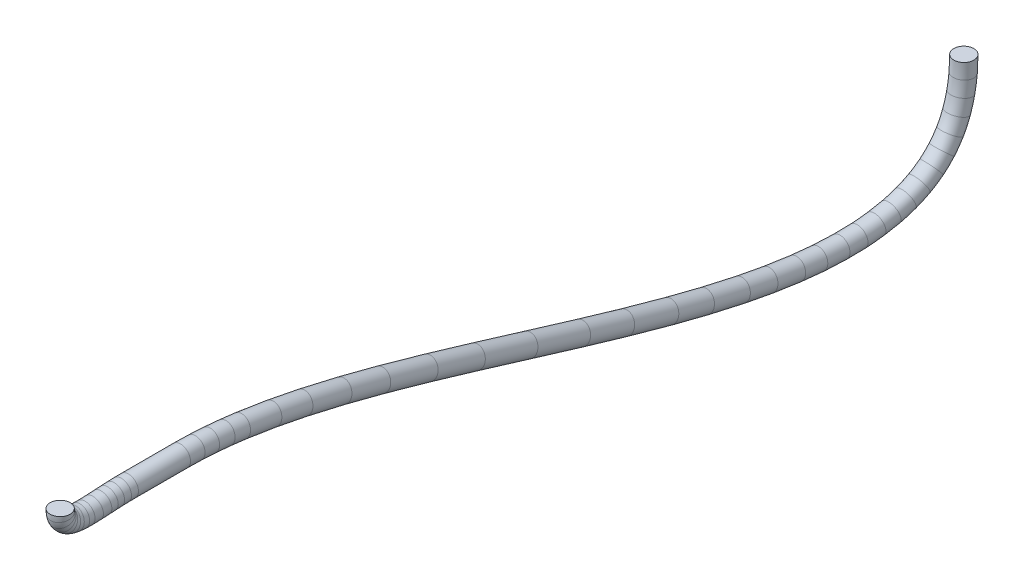
ISO-10303-21;
HEADER;
FILE_DESCRIPTION(('STEP AP214'),'2;1');
FILE_NAME('part.step','',(''),(''),'','','');
FILE_SCHEMA(('AUTOMOTIVE_DESIGN { 1 0 10303 214 1 1 1 1 }'));
ENDSEC;
DATA;
#1=APPLICATION_CONTEXT('core data for automotive mechanical design processes');
#2=APPLICATION_PROTOCOL_DEFINITION('international standard','automotive_design',2000,#1);
#3=PRODUCT_CONTEXT('',#1,'mechanical');
#4=PRODUCT('Part','Part','',(#3));
#5=PRODUCT_RELATED_PRODUCT_CATEGORY('part','',(#4));
#6=PRODUCT_DEFINITION_FORMATION('','',#4);
#7=PRODUCT_DEFINITION_CONTEXT('part definition',#1,'design');
#8=PRODUCT_DEFINITION('design','',#6,#7);
#9=PRODUCT_DEFINITION_SHAPE('','',#8);
#10=(LENGTH_UNIT() NAMED_UNIT(*) SI_UNIT(.MILLI.,.METRE.));
#11=(NAMED_UNIT(*) PLANE_ANGLE_UNIT() SI_UNIT($,.RADIAN.));
#12=(NAMED_UNIT(*) SI_UNIT($,.STERADIAN.) SOLID_ANGLE_UNIT());
#13=UNCERTAINTY_MEASURE_WITH_UNIT(LENGTH_MEASURE(1.E-05),#10,'distance_accuracy_value','');
#14=(GEOMETRIC_REPRESENTATION_CONTEXT(3) GLOBAL_UNCERTAINTY_ASSIGNED_CONTEXT((#13)) GLOBAL_UNIT_ASSIGNED_CONTEXT((#10,
#11,#12)) REPRESENTATION_CONTEXT('',''));
#15=CARTESIAN_POINT('',(0.,0.,0.));
#16=DIRECTION('',(0.,0.,1.));
#17=DIRECTION('',(1.,0.,0.));
#18=AXIS2_PLACEMENT_3D('',#15,#16,#17);
#19=CARTESIAN_POINT('',(5.24968353162512,-230.95,243.324757540876));
#20=DIRECTION('',(0.,-1.,0.));
#21=DIRECTION('',(-1.,0.,0.));
#22=AXIS2_PLACEMENT_3D('',#19,#20,#21);
#23=PLANE('',#22);
#24=CARTESIAN_POINT('',(5.24968353162512,-230.95,243.324757540876));
#25=DIRECTION('',(0.,-1.,0.));
#26=DIRECTION('',(0.,0.,1.));
#27=AXIS2_PLACEMENT_3D('',#24,#25,#26);
#28=CIRCLE('',#27,0.77);
#29=CARTESIAN_POINT('',(5.24968353162512,-230.95,244.094757540876));
#30=VERTEX_POINT('',#29);
#31=EDGE_CURVE('E11',#30,#30,#28,.T.);
#32=ORIENTED_EDGE('',*,*,#31,.F.);
#33=EDGE_LOOP('',(#32));
#34=FACE_BOUND('',#33,.T.);
#35=ADVANCED_FACE('F43',(#34),#23,.F.);
#36=CARTESIAN_POINT('',(5.0748948806526,-230.95,257.270595256948));
#37=DIRECTION('',(0.999921466294673,0.,0.012532407714073));
#38=DIRECTION('',(0.012532407714073,0.,-0.999921466294673));
#39=AXIS2_PLACEMENT_3D('',#36,#37,#38);
#40=TOROIDAL_SURFACE('',#39,13.9469330203995,0.77);
#41=ORIENTED_EDGE('',*,*,#31,.T.);
#42=EDGE_LOOP('',(#41));
#43=FACE_BOUND('',#42,.T.);
#44=CARTESIAN_POINT('',(5.24904137688839,-232.144421709399,243.37599305129));
#45=DIRECTION('',(-0.00107328111655938,-0.996326107369345,0.0856337307484272));
#46=DIRECTION('',(4.60391044394124E-05,0.0856337307484272,0.996326684395488));
#47=AXIS2_PLACEMENT_3D('',#44,#45,#46);
#48=CIRCLE('',#47,0.77);
#49=CARTESIAN_POINT('',(5.24907682699881,-232.078483736723,244.143164598274));
#50=VERTEX_POINT('',#49);
#51=EDGE_CURVE('E53',#50,#50,#48,.T.);
#52=ORIENTED_EDGE('',*,*,#51,.F.);
#53=EDGE_LOOP('',(#52));
#54=FACE_BOUND('',#53,.T.);
#55=ADVANCED_FACE('F328',(#43,#54),#40,.T.);
#56=CARTESIAN_POINT('',(5.12396192345232,-231.273826335851,253.5035753326));
#57=DIRECTION('',(-0.999923726127993,1.56135381442176E-05,-0.0123507765961815));
#58=DIRECTION('',(-0.0123507765976869,0.,0.999923726249874));
#59=AXIS2_PLACEMENT_3D('',#56,#57,#58);
#60=TOROIDAL_SURFACE('',#59,10.1657023386899,0.77);
#61=CARTESIAN_POINT('',(5.24689794232796,-233.326519028539,243.548031978092));
#62=DIRECTION('',(-0.00250920096557245,-0.979401327154709,0.201907761807487));
#63=DIRECTION('',(0.000256872652281758,0.201907759491489,0.979404508195448));
#64=AXIS2_PLACEMENT_3D('',#61,#62,#63);
#65=CIRCLE('',#64,0.77);
#66=CARTESIAN_POINT('',(5.24709573427022,-233.17105005373,244.302173449402));
#67=VERTEX_POINT('',#66);
#68=EDGE_CURVE('E236',#67,#67,#65,.T.);
#69=ORIENTED_EDGE('',*,*,#68,.F.);
#70=EDGE_LOOP('',(#69));
#71=FACE_BOUND('',#70,.T.);
#72=ORIENTED_EDGE('',*,*,#51,.T.);
#73=EDGE_LOOP('',(#72));
#74=FACE_BOUND('',#73,.T.);
#75=ADVANCED_FACE('F335',(#71,#74),#60,.T.);
#76=CARTESIAN_POINT('',(5.14297806845295,-231.577711003224,252.029747241306));
#77=DIRECTION('',(-0.999924861807434,3.46504543539627E-05,-0.0122584476476255));
#78=DIRECTION('',(-0.0122584476549845,0.,0.999924862407716));
#79=AXIS2_PLACEMENT_3D('',#76,#77,#78);
#80=TOROIDAL_SURFACE('',#79,8.66075185280264,0.77);
#81=CARTESIAN_POINT('',(5.24293003548449,-234.474581719558,243.868450021319));
#82=DIRECTION('',(-0.0041328895323715,-0.942401928786135,0.334457058296406));
#83=DIRECTION('',(0.000714986324046932,0.334457044428597,0.942410724804553));
#84=AXIS2_PLACEMENT_3D('',#81,#82,#83);
#85=CIRCLE('',#84,0.77);
#86=CARTESIAN_POINT('',(5.24348057495401,-234.217049795348,244.594106279419));
#87=VERTEX_POINT('',#86);
#88=EDGE_CURVE('E212',#87,#87,#85,.T.);
#89=ORIENTED_EDGE('',*,*,#88,.F.);
#90=EDGE_LOOP('',(#89));
#91=FACE_BOUND('',#90,.T.);
#92=ORIENTED_EDGE('',*,*,#68,.T.);
#93=EDGE_LOOP('',(#92));
#94=FACE_BOUND('',#93,.T.);
#95=ADVANCED_FACE('F369',(#91,#94),#80,.T.);
#96=CARTESIAN_POINT('',(5.16728173385934,-232.241525843028,250.1596119713));
#97=DIRECTION('',(-0.999927259751701,0.000104786281682033,-0.0120608550811853));
#98=DIRECTION('',(-0.0120608551474004,0.,0.999927265241384));
#99=AXIS2_PLACEMENT_3D('',#96,#97,#98);
#100=TOROIDAL_SURFACE('',#99,6.67615008025853,0.77);
#101=CARTESIAN_POINT('',(5.23682959366195,-235.556122237873,244.364821748298));
#102=DIRECTION('',(-0.00607896479311672,-0.868046320935459,0.496445999981325));
#103=DIRECTION('',(0.00162868645288771,0.496445919935974,0.868066124186034));
#104=AXIS2_PLACEMENT_3D('',#101,#102,#103);
#105=CIRCLE('',#104,0.77);
#106=CARTESIAN_POINT('',(5.23808368223067,-235.173858879522,245.033232663921));
#107=VERTEX_POINT('',#106);
#108=EDGE_CURVE('E210',#107,#107,#105,.T.);
#109=ORIENTED_EDGE('',*,*,#108,.F.);
#110=EDGE_LOOP('',(#109));
#111=FACE_BOUND('',#110,.T.);
#112=ORIENTED_EDGE('',*,*,#88,.T.);
#113=EDGE_LOOP('',(#112));
#114=FACE_BOUND('',#113,.T.);
#115=ADVANCED_FACE('F424',(#111,#114),#100,.T.);
#116=CARTESIAN_POINT('',(5.17379080379132,-232.518432694903,249.675514193058));
#117=DIRECTION('',(-0.999928443325836,0.000161505477794451,-0.0119616948611251));
#118=DIRECTION('',(-0.0119616950171297,0.,0.999928456366913));
#119=AXIS2_PLACEMENT_3D('',#116,#117,#118);
#120=TOROIDAL_SURFACE('',#119,6.11841367442019,0.77);
#121=CARTESIAN_POINT('',(5.22911386483791,-236.461643425625,244.997585764429));
#122=DIRECTION('',(-0.00783258490682083,-0.764619016978677,0.644434953651833));
#123=DIRECTION('',(0.00288966355690776,0.644434724493458,0.764653866603426));
#124=AXIS2_PLACEMENT_3D('',#121,#122,#123);
#125=CIRCLE('',#124,0.77);
#126=CARTESIAN_POINT('',(5.23133890577673,-235.965428687765,245.586369241714));
#127=VERTEX_POINT('',#126);
#128=EDGE_CURVE('E213',#127,#127,#125,.T.);
#129=ORIENTED_EDGE('',*,*,#128,.F.);
#130=EDGE_LOOP('',(#129));
#131=FACE_BOUND('',#130,.T.);
#132=ORIENTED_EDGE('',*,*,#108,.T.);
#133=EDGE_LOOP('',(#132));
#134=FACE_BOUND('',#133,.T.);
#135=ADVANCED_FACE('F420',(#131,#134),#120,.T.);
#136=CARTESIAN_POINT('',(5.17630312424123,-232.598910661164,249.58005800289));
#137=DIRECTION('',(-0.999930503616955,0.00031025322509349,-0.0117852314053985));
#138=DIRECTION('',(-0.0117852319726044,0.,0.999930551742146));
#139=AXIS2_PLACEMENT_3D('',#136,#137,#138);
#140=TOROIDAL_SURFACE('',#139,5.99354195782581,0.77);
#141=CARTESIAN_POINT('',(5.2196025202202,-237.237006733154,245.784174022903));
#142=DIRECTION('',(-0.00931648116066426,-0.633370134036581,0.773792915765754));
#143=DIRECTION('',(0.00447648709641838,0.773792328230094,0.63342355011124));
#144=AXIS2_PLACEMENT_3D('',#141,#142,#143);
#145=CIRCLE('',#144,0.77);
#146=CARTESIAN_POINT('',(5.22304941528444,-236.641186640417,246.271910156488));
#147=VERTEX_POINT('',#146);
#148=EDGE_CURVE('E224',#147,#147,#145,.T.);
#149=ORIENTED_EDGE('',*,*,#148,.F.);
#150=EDGE_LOOP('',(#149));
#151=FACE_BOUND('',#150,.T.);
#152=ORIENTED_EDGE('',*,*,#128,.T.);
#153=EDGE_LOOP('',(#152));
#154=FACE_BOUND('',#153,.T.);
#155=ADVANCED_FACE('F416',(#151,#154),#140,.T.);
#156=CARTESIAN_POINT('',(5.17427278205257,-232.287492829978,249.83493735603));
#157=DIRECTION('',(-0.999931484793308,0.000416360646929899,-0.0116983914647493));
#158=DIRECTION('',(-0.0116983924787437,0.,0.999931571465474));
#159=AXIS2_PLACEMENT_3D('',#156,#157,#158);
#160=TOROIDAL_SURFACE('',#159,6.3959695311887,0.77);
#161=CARTESIAN_POINT('',(5.20845243151708,-237.870619210664,246.714687716538));
#162=DIRECTION('',(-0.0104148005759073,-0.487875323146402,0.87285119063547));
#163=DIRECTION('',(0.00621966975069926,0.872850040660919,0.487948893047647));
#164=AXIS2_PLACEMENT_3D('',#161,#162,#163);
#165=CIRCLE('',#164,0.77);
#166=CARTESIAN_POINT('',(5.21324157722512,-237.198524679355,247.090408364185));
#167=VERTEX_POINT('',#166);
#168=EDGE_CURVE('E227',#167,#167,#165,.T.);
#169=ORIENTED_EDGE('',*,*,#168,.F.);
#170=EDGE_LOOP('',(#169));
#171=FACE_BOUND('',#170,.T.);
#172=ORIENTED_EDGE('',*,*,#148,.T.);
#173=EDGE_LOOP('',(#172));
#174=FACE_BOUND('',#173,.T.);
#175=ADVANCED_FACE('F419',(#171,#174),#160,.T.);
#176=CARTESIAN_POINT('',(5.1680661383168,-230.889365269744,250.616338930103));
#177=DIRECTION('',(-0.999933013635121,0.000673159565444983,-0.0115548733781435));
#178=DIRECTION('',(-0.011554875996154,0.,0.999933240191921));
#179=AXIS2_PLACEMENT_3D('',#176,#177,#178);
#180=TOROIDAL_SURFACE('',#179,7.99765089464502,0.77);
#181=CARTESIAN_POINT('',(5.19633890298933,-238.349911800838,247.735043051377));
#182=DIRECTION('',(-0.0110213915987776,-0.360284488203109,0.932777367053602));
#183=DIRECTION('',(0.0077342093815182,0.932775406000503,0.360375115630698));
#184=AXIS2_PLACEMENT_3D('',#181,#182,#183);
#185=CIRCLE('',#184,0.77);
#186=CARTESIAN_POINT('',(5.2022942442131,-237.631674738218,248.012531890413));
#187=VERTEX_POINT('',#186);
#188=EDGE_CURVE('E269',#187,#187,#185,.T.);
#189=ORIENTED_EDGE('',*,*,#188,.F.);
#190=EDGE_LOOP('',(#189));
#191=FACE_BOUND('',#190,.T.);
#192=ORIENTED_EDGE('',*,*,#168,.T.);
#193=EDGE_LOOP('',(#192));
#194=FACE_BOUND('',#193,.T.);
#195=ADVANCED_FACE('F462',(#191,#194),#180,.T.);
#196=CARTESIAN_POINT('',(5.1649936619859,-229.659352754398,251.091393945652));
#197=DIRECTION('',(-0.99993360202921,0.000832261267531237,-0.0114934274292904));
#198=DIRECTION('',(-0.0114934314098044,0.,0.999933948335803));
#199=AXIS2_PLACEMENT_3D('',#196,#197,#198);
#200=TOROIDAL_SURFACE('',#199,9.31621652760916,0.77);
#201=CARTESIAN_POINT('',(5.18322899083766,-238.701932792349,248.850121066387));
#202=DIRECTION('',(-0.0113560651723369,-0.240584108696933,0.970561861205304));
#203=DIRECTION('',(0.00914133689401875,0.970558910298777,0.240690335492395));
#204=AXIS2_PLACEMENT_3D('',#201,#202,#203);
#205=CIRCLE('',#204,0.77);
#206=CARTESIAN_POINT('',(5.19026782024605,-237.954602431419,249.035452624716));
#207=VERTEX_POINT('',#206);
#208=EDGE_CURVE('E267',#207,#207,#205,.T.);
#209=ORIENTED_EDGE('',*,*,#208,.F.);
#210=EDGE_LOOP('',(#209));
#211=FACE_BOUND('',#210,.T.);
#212=ORIENTED_EDGE('',*,*,#188,.T.);
#213=EDGE_LOOP('',(#212));
#214=FACE_BOUND('',#213,.T.);
#215=ADVANCED_FACE('F449',(#211,#214),#200,.T.);
#216=CARTESIAN_POINT('',(5.16317642336946,-226.286435817303,251.927455623717));
#217=DIRECTION('',(-0.999934288916584,0.00121053123399229,-0.011399669425782));
#218=DIRECTION('',(-0.0113996777782484,0.,0.999935021562177));
#219=AXIS2_PLACEMENT_3D('',#216,#217,#218);
#220=TOROIDAL_SURFACE('',#219,12.7912061675432,0.77);
#221=CARTESIAN_POINT('',(5.16986690857264,-238.931256444879,249.997838626903));
#222=DIRECTION('',(-0.0114518236066476,-0.150851017771999,0.988490175051444));
#223=DIRECTION('',(0.0101859073416779,0.988486109490571,0.150968402772966));
#224=AXIS2_PLACEMENT_3D('',#221,#222,#223);
#225=CIRCLE('',#224,0.77);
#226=CARTESIAN_POINT('',(5.17771005722573,-238.170122140572,250.114084297038));
#227=VERTEX_POINT('',#226);
#228=EDGE_CURVE('E262',#227,#227,#225,.T.);
#229=ORIENTED_EDGE('',*,*,#228,.F.);
#230=EDGE_LOOP('',(#229));
#231=FACE_BOUND('',#230,.T.);
#232=ORIENTED_EDGE('',*,*,#208,.T.);
#233=EDGE_LOOP('',(#232));
#234=FACE_BOUND('',#233,.T.);
#235=ADVANCED_FACE('F443',(#231,#234),#220,.T.);
#236=CARTESIAN_POINT('',(5.16548148912275,-223.946716401397,252.28454106705));
#237=DIRECTION('',(-0.99993438386414,0.00144161136022933,-0.0113644059646102));
#238=DIRECTION('',(-0.0113644177736289,0.,0.999935422919233));
#239=AXIS2_PLACEMENT_3D('',#236,#237,#238);
#240=TOROIDAL_SURFACE('',#239,15.158016611563,0.77);
#241=CARTESIAN_POINT('',(5.15422136859448,-239.076266224772,251.356067616637));
#242=DIRECTION('',(-0.0114313665546594,-0.0612405030804673,0.998057575814714));
#243=DIRECTION('',(0.0112180134444051,0.998052125044579,0.0613686554224686));
#244=AXIS2_PLACEMENT_3D('',#241,#242,#243);
#245=CIRCLE('',#244,0.77);
#246=CARTESIAN_POINT('',(5.16285923894667,-238.307766088488,251.403321481312));
#247=VERTEX_POINT('',#246);
#248=EDGE_CURVE('E216',#247,#247,#245,.T.);
#249=ORIENTED_EDGE('',*,*,#248,.F.);
#250=EDGE_LOOP('',(#249));
#251=FACE_BOUND('',#250,.T.);
#252=ORIENTED_EDGE('',*,*,#228,.T.);
#253=EDGE_LOOP('',(#252));
#254=FACE_BOUND('',#253,.T.);
#255=ADVANCED_FACE('F438',(#251,#254),#240,.T.);
#256=CARTESIAN_POINT('',(5.18281952873429,-217.676568517406,252.669473978342));
#257=DIRECTION('',(-0.999933770131024,0.00203156120988107,-0.0113281997954771));
#258=DIRECTION('',(-0.0113282231726545,0.,0.999935833621213));
#259=AXIS2_PLACEMENT_3D('',#256,#257,#258);
#260=TOROIDAL_SURFACE('',#259,21.439984050655,0.77);
#261=CARTESIAN_POINT('',(5.13866380234599,-239.116442461783,252.722120093432));
#262=DIRECTION('',(-0.0113231530981032,0.00247867876730517,0.999932818921094));
#263=DIRECTION('',(0.0119436112864676,0.999925926538434,-0.00234341325687878));
#264=AXIS2_PLACEMENT_3D('',#261,#262,#263);
#265=CIRCLE('',#264,0.77);
#266=CARTESIAN_POINT('',(5.14786038303657,-238.346499498348,252.720315665224));
#267=VERTEX_POINT('',#266);
#268=EDGE_CURVE('E214',#267,#267,#265,.T.);
#269=ORIENTED_EDGE('',*,*,#268,.F.);
#270=EDGE_LOOP('',(#269));
#271=FACE_BOUND('',#270,.T.);
#272=ORIENTED_EDGE('',*,*,#248,.T.);
#273=EDGE_LOOP('',(#272));
#274=FACE_BOUND('',#273,.T.);
#275=ADVANCED_FACE('F361',(#271,#274),#260,.T.);
#276=CARTESIAN_POINT('',(5.20077807656468,-213.557380502181,252.65946650955));
#277=DIRECTION('',(-0.999932937891432,0.00240229079996762,-0.0113291093525696));
#278=DIRECTION('',(-0.0113291420428623,0.,0.999935823210956));
#279=AXIS2_PLACEMENT_3D('',#276,#277,#278);
#280=TOROIDAL_SURFACE('',#279,25.5592142271517,0.77);
#281=CARTESIAN_POINT('',(5.11965239461493,-239.056251354399,254.412873420404));
#282=DIRECTION('',(-0.0111375608198021,0.0686331117157715,0.997579796665508));
#283=DIRECTION('',(0.0126873957821722,0.997571066073339,-0.0684908615916703));
#284=AXIS2_PLACEMENT_3D('',#281,#282,#283);
#285=CIRCLE('',#284,0.77);
#286=CARTESIAN_POINT('',(5.1294216893672,-238.288121633523,254.360135456978));
#287=VERTEX_POINT('',#286);
#288=EDGE_CURVE('E217',#287,#287,#285,.T.);
#289=ORIENTED_EDGE('',*,*,#288,.F.);
#290=EDGE_LOOP('',(#289));
#291=FACE_BOUND('',#290,.T.);
#292=ORIENTED_EDGE('',*,*,#268,.T.);
#293=EDGE_LOOP('',(#292));
#294=FACE_BOUND('',#293,.T.);
#295=ADVANCED_FACE('F357',(#291,#294),#280,.T.);
#296=CARTESIAN_POINT('',(5.2732480137285,-202.396588050501,251.892417317701));
#297=DIRECTION('',(-0.999929239218927,0.0034058226866631,-0.0113981106716926));
#298=DIRECTION('',(-0.0113981767791906,0.,0.999935038673068));
#299=AXIS2_PLACEMENT_3D('',#296,#297,#298);
#300=TOROIDAL_SURFACE('',#299,36.7465264227114,0.77);
#301=CARTESIAN_POINT('',(5.10097097834605,-238.901245847709,256.098066359986));
#302=DIRECTION('',(-0.0109332901309572,0.114495586102539,0.993363591002785));
#303=DIRECTION('',(0.013195763290434,0.993352983136303,-0.1143491264741));
#304=AXIS2_PLACEMENT_3D('',#301,#302,#303);
#305=CIRCLE('',#304,0.77);
#306=CARTESIAN_POINT('',(5.11113171607968,-238.136364050694,256.010017532601));
#307=VERTEX_POINT('',#306);
#308=EDGE_CURVE('E229',#307,#307,#305,.T.);
#309=ORIENTED_EDGE('',*,*,#308,.F.);
#310=EDGE_LOOP('',(#309));
#311=FACE_BOUND('',#310,.T.);
#312=ORIENTED_EDGE('',*,*,#288,.T.);
#313=EDGE_LOOP('',(#312));
#314=FACE_BOUND('',#313,.T.);
#315=ADVANCED_FACE('F360',(#311,#314),#300,.T.);
#316=CARTESIAN_POINT('',(5.33695933223803,-195.10511856413,251.052700112808));
#317=DIRECTION('',(-0.999925902291017,0.00406610011188762,-0.0114741778518016));
#318=DIRECTION('',(-0.011474272705245,0.,0.999934168366041));
#319=AXIS2_PLACEMENT_3D('',#316,#317,#318);
#320=TOROIDAL_SURFACE('',#319,44.0864171385114,0.77);
#321=CARTESIAN_POINT('',(5.07791749703297,-238.605597552684,258.211848190952));
#322=DIRECTION('',(-0.0106613884787904,0.162444361746452,0.986660105675958));
#323=DIRECTION('',(0.0137186629416303,0.986647080967109,-0.162293979882735));
#324=AXIS2_PLACEMENT_3D('',#321,#322,#323);
#325=CIRCLE('',#324,0.77);
#326=CARTESIAN_POINT('',(5.08848086749803,-237.845879300339,258.086881826442));
#327=VERTEX_POINT('',#326);
#328=EDGE_CURVE('E209',#327,#327,#325,.T.);
#329=ORIENTED_EDGE('',*,*,#328,.F.);
#330=EDGE_LOOP('',(#329));
#331=FACE_BOUND('',#330,.T.);
#332=ORIENTED_EDGE('',*,*,#308,.T.);
#333=EDGE_LOOP('',(#332));
#334=FACE_BOUND('',#333,.T.);
#335=ADVANCED_FACE('F355',(#331,#334),#320,.T.);
#336=CARTESIAN_POINT('',(5.58426599900101,-174.701153139808,247.696050250386));
#337=DIRECTION('',(-0.999912601927665,0.0059827950896209,-0.0117896000424723));
#338=DIRECTION('',(-0.0117898110456484,0.,0.999930497762474));
#339=AXIS2_PLACEMENT_3D('',#336,#337,#338);
#340=TOROIDAL_SURFACE('',#339,64.7658583734564,0.77);
#341=CARTESIAN_POINT('',(5.05543554196793,-238.224139513753,260.312188777444));
#342=DIRECTION('',(-0.010397929528536,0.194875369792719,0.980772895888579));
#343=DIRECTION('',(0.0140657835414628,0.980757382188605,-0.194723165072674));
#344=AXIS2_PLACEMENT_3D('',#341,#342,#343);
#345=CIRCLE('',#344,0.77);
#346=CARTESIAN_POINT('',(5.06626619529486,-237.468956329467,260.162251940338));
#347=VERTEX_POINT('',#346);
#348=EDGE_CURVE('E147',#347,#347,#345,.T.);
#349=ORIENTED_EDGE('',*,*,#348,.F.);
#350=EDGE_LOOP('',(#349));
#351=FACE_BOUND('',#350,.T.);
#352=ORIENTED_EDGE('',*,*,#328,.T.);
#353=EDGE_LOOP('',(#352));
#354=FACE_BOUND('',#353,.T.);
#355=ADVANCED_FACE('F351',(#351,#354),#340,.T.);
#356=CARTESIAN_POINT('',(5.81591775887713,-160.475014869845,244.871833483146));
#357=DIRECTION('',(-0.999899919531076,0.00738368115377129,-0.0120678156418905));
#358=DIRECTION('',(-0.0120681446164382,0.,0.999927177291185));
#359=AXIS2_PLACEMENT_3D('',#356,#357,#358);
#360=TOROIDAL_SURFACE('',#359,79.2711125676327,0.77);
#361=CARTESIAN_POINT('',(5.02680457670815,-237.630170501913,263.047876712832));
#362=DIRECTION('',(-0.0100526920883572,0.229386802407344,0.973283431618514));
#363=DIRECTION('',(0.0144269577185918,0.973264576160402,-0.229233347666301));
#364=AXIS2_PLACEMENT_3D('',#361,#362,#363);
#365=CIRCLE('',#364,0.77);
#366=CARTESIAN_POINT('',(5.03791333415147,-236.880756778269,262.871367035129));
#367=VERTEX_POINT('',#366);
#368=EDGE_CURVE('E152',#367,#367,#365,.T.);
#369=ORIENTED_EDGE('',*,*,#368,.F.);
#370=EDGE_LOOP('',(#369));
#371=FACE_BOUND('',#370,.T.);
#372=ORIENTED_EDGE('',*,*,#348,.T.);
#373=EDGE_LOOP('',(#372));
#374=FACE_BOUND('',#373,.T.);
#375=ADVANCED_FACE('F354',(#371,#374),#360,.T.);
#376=CARTESIAN_POINT('',(6.89164570977547,-115.42764607524,234.266024745883));
#377=DIRECTION('',(-0.999839165076537,0.0121510282503366,-0.0131907729687246));
#378=DIRECTION('',(-0.0131917468688151,0.,0.99991298512148));
#379=AXIS2_PLACEMENT_3D('',#376,#377,#378);
#380=TOROIDAL_SURFACE('',#379,125.560063759742,0.77);
#381=CARTESIAN_POINT('',(4.99912407683018,-236.957583465082,265.765584921231));
#382=DIRECTION('',(-0.00971902793698233,0.251030915605625,0.967930276366104));
#383=DIRECTION('',(0.0146474139412616,0.967907881078682,-0.250878032140339));
#384=AXIS2_PLACEMENT_3D('',#381,#382,#383);
#385=CIRCLE('',#384,0.77);
#386=CARTESIAN_POINT('',(5.01040258556495,-236.212294396651,265.572408836483));
#387=VERTEX_POINT('',#386);
#388=EDGE_CURVE('E223',#387,#387,#385,.T.);
#389=ORIENTED_EDGE('',*,*,#388,.F.);
#390=EDGE_LOOP('',(#389));
#391=FACE_BOUND('',#390,.T.);
#392=ORIENTED_EDGE('',*,*,#368,.T.);
#393=EDGE_LOOP('',(#392));
#394=FACE_BOUND('',#393,.T.);
#395=ADVANCED_FACE('F380',(#391,#394),#380,.T.);
#396=CARTESIAN_POINT('',(8.13767229498654,-79.5711898985418,224.979230979255));
#397=DIRECTION('',(-0.999766490161775,0.0162437742654656,-0.0142514892982588));
#398=DIRECTION('',(0.0162454241122463,0.999868034390246,0.));
#399=AXIS2_PLACEMENT_3D('',#396,#397,#398);
#400=TOROIDAL_SURFACE('',#399,162.615663552684,0.77);
#401=CARTESIAN_POINT('',(4.96593820793933,-236.045546054089,269.133166265565));
#402=DIRECTION('',(-0.0093027081243556,0.271737825723965,0.962326355085615));
#403=DIRECTION('',(0.0148514872069348,0.962299395928259,-0.271586645334139));
#404=AXIS2_PLACEMENT_3D('',#401,#402,#403);
#405=CIRCLE('',#404,0.77);
#406=CARTESIAN_POINT('',(4.97737385308867,-235.304575519224,268.924044548658));
#407=VERTEX_POINT('',#406);
#408=EDGE_CURVE('E221',#407,#407,#405,.T.);
#409=ORIENTED_EDGE('',*,*,#408,.F.);
#410=EDGE_LOOP('',(#409));
#411=FACE_BOUND('',#410,.T.);
#412=ORIENTED_EDGE('',*,*,#388,.T.);
#413=EDGE_LOOP('',(#412));
#414=FACE_BOUND('',#413,.T.);
#415=ADVANCED_FACE('F414',(#411,#414),#400,.T.);
#416=CARTESIAN_POINT('',(18.499072242577,83.9183868882644,178.913867798837));
#417=DIRECTION('',(-0.999129131083777,0.0366199012053684,-0.0199990563648998));
#418=DIRECTION('',(0.0366272266920211,0.999328998010591,0.));
#419=AXIS2_PLACEMENT_3D('',#416,#417,#418);
#420=TOROIDAL_SURFACE('',#419,332.71547291427,0.77);
#421=CARTESIAN_POINT('',(4.93422373253751,-235.079814249697,272.485917430187));
#422=DIRECTION('',(-0.0088756431010214,0.281807888255374,0.959429797888616));
#423=DIRECTION('',(0.0149467755076472,0.959397788967474,-0.281660214489455));
#424=AXIS2_PLACEMENT_3D('',#421,#422,#423);
#425=CIRCLE('',#424,0.77);
#426=CARTESIAN_POINT('',(4.9457327496784,-234.341077952192,272.26903906503));
#427=VERTEX_POINT('',#426);
#428=EDGE_CURVE('E202',#427,#427,#425,.T.);
#429=ORIENTED_EDGE('',*,*,#428,.F.);
#430=EDGE_LOOP('',(#429));
#431=FACE_BOUND('',#430,.T.);
#432=ORIENTED_EDGE('',*,*,#408,.T.);
#433=EDGE_LOOP('',(#432));
#434=FACE_BOUND('',#433,.T.);
#435=ADVANCED_FACE('F366',(#431,#434),#420,.T.);
#436=CARTESIAN_POINT('',(50.8662060077846,340.779255745024,103.7670044643));
#437=DIRECTION('',(-0.997043751117185,0.0707369243477187,-0.0300007648568693));
#438=DIRECTION('',(0.0707687790914665,0.997492746793631,0.));
#439=AXIS2_PLACEMENT_3D('',#436,#437,#438);
#440=TOROIDAL_SURFACE('',#439,601.821806752887,0.77);
#441=CARTESIAN_POINT('',(4.89817440198765,-233.885994760051,276.498811076563));
#442=DIRECTION('',(-0.00834446385745979,0.288457883314737,0.957456223268987));
#443=DIRECTION('',(0.0150065627843381,0.957417857161314,-0.288315538710694));
#444=AXIS2_PLACEMENT_3D('',#441,#442,#443);
#445=CIRCLE('',#444,0.77);
#446=CARTESIAN_POINT('',(4.90972945533159,-233.148783010036,276.276808111756));
#447=VERTEX_POINT('',#446);
#448=EDGE_CURVE('E200',#447,#447,#445,.T.);
#449=ORIENTED_EDGE('',*,*,#448,.F.);
#450=EDGE_LOOP('',(#449));
#451=FACE_BOUND('',#450,.T.);
#452=ORIENTED_EDGE('',*,*,#428,.T.);
#453=EDGE_LOOP('',(#452));
#454=FACE_BOUND('',#453,.T.);
#455=ADVANCED_FACE('F363',(#451,#454),#440,.T.);
#456=CARTESIAN_POINT('',(128.322876109013,-1109.10272826028,541.255646105514));
#457=DIRECTION('',(0.990977551170572,0.130471344857442,-0.0306711794208627));
#458=DIRECTION('',(0.130532756772581,-0.991443997111965,0.));
#459=AXIS2_PLACEMENT_3D('',#456,#457,#458);
#460=TOROIDAL_SURFACE('',#459,922.677716911398,0.77);
#461=CARTESIAN_POINT('',(4.86450797302669,-232.687270950494,280.510278341283));
#462=DIRECTION('',(-0.00773737452209147,0.28415059232391,0.958748441415931));
#463=DIRECTION('',(0.014970480312079,0.958702606388962,-0.284016191831094));
#464=AXIS2_PLACEMENT_3D('',#461,#462,#463);
#465=CIRCLE('',#464,0.77);
#466=CARTESIAN_POINT('',(4.87603524286699,-231.949069943574,280.291585873574));
#467=VERTEX_POINT('',#466);
#468=EDGE_CURVE('E203',#467,#467,#465,.T.);
#469=ORIENTED_EDGE('',*,*,#468,.F.);
#470=EDGE_LOOP('',(#469));
#471=FACE_BOUND('',#470,.T.);
#472=ORIENTED_EDGE('',*,*,#448,.T.);
#473=EDGE_LOOP('',(#472));
#474=FACE_BOUND('',#473,.T.);
#475=ADVANCED_FACE('F345',(#471,#474),#460,.T.);
#476=CARTESIAN_POINT('',(33.6032976752988,-640.34212333683,401.561563052911));
#477=DIRECTION('',(0.997694178442122,0.0668434624221849,-0.0117591595835847));
#478=DIRECTION('',(0.0668480843861309,-0.997763165091749,0.));
#479=AXIS2_PLACEMENT_3D('',#476,#477,#478);
#480=TOROIDAL_SURFACE('',#479,426.218031338437,0.77);
#481=CARTESIAN_POINT('',(4.83661388280626,-231.637820788354,284.109099392248));
#482=DIRECTION('',(-0.00714402019866776,0.275727216171857,0.961209376378279));
#483=DIRECTION('',(0.0149052570580215,0.961156479378031,-0.275601261720011));
#484=AXIS2_PLACEMENT_3D('',#481,#482,#483);
#485=CIRCLE('',#484,0.77);
#486=CARTESIAN_POINT('',(4.84809093074094,-230.897730299233,283.896886420723));
#487=VERTEX_POINT('',#486);
#488=EDGE_CURVE('E204',#487,#487,#485,.T.);
#489=ORIENTED_EDGE('',*,*,#488,.F.);
#490=EDGE_LOOP('',(#489));
#491=FACE_BOUND('',#490,.T.);
#492=ORIENTED_EDGE('',*,*,#468,.T.);
#493=EDGE_LOOP('',(#492));
#494=FACE_BOUND('',#493,.T.);
#495=ADVANCED_FACE('F341',(#491,#494),#480,.T.);
#496=CARTESIAN_POINT('',(12.1184575935641,-416.374990909985,337.155905356285));
#497=DIRECTION('',(0.999257547958647,0.0383608735236405,-0.00357718187608632));
#498=DIRECTION('',(0.0383611189632797,-0.9992639413848,0.));
#499=AXIS2_PLACEMENT_3D('',#496,#497,#498);
#500=TOROIDAL_SURFACE('',#499,192.340351708533,0.77);
#501=CARTESIAN_POINT('',(4.81121754884198,-230.639344234988,287.722266075813));
#502=DIRECTION('',(-0.0064048307299186,0.256956359192495,0.966401783738968));
#503=DIRECTION('',(0.0147734023820948,0.96634044815675,-0.256842139919191));
#504=AXIS2_PLACEMENT_3D('',#501,#502,#503);
#505=CIRCLE('',#504,0.77);
#506=CARTESIAN_POINT('',(4.82259306867619,-229.895262089907,287.524497628075));
#507=VERTEX_POINT('',#506);
#508=EDGE_CURVE('E207',#507,#507,#505,.T.);
#509=ORIENTED_EDGE('',*,*,#508,.F.);
#510=EDGE_LOOP('',(#509));
#511=FACE_BOUND('',#510,.T.);
#512=ORIENTED_EDGE('',*,*,#488,.T.);
#513=EDGE_LOOP('',(#512));
#514=FACE_BOUND('',#513,.T.);
#515=ADVANCED_FACE('F344',(#511,#514),#500,.T.);
#516=CARTESIAN_POINT('',(9.66448189777065,-373.327390931654,325.69372466948));
#517=DIRECTION('',(0.999439724113134,0.0333938837880907,-0.00225530268720076));
#518=DIRECTION('',(0.0333939687155765,-0.999442265893045,0.));
#519=AXIS2_PLACEMENT_3D('',#516,#517,#518);
#520=TOROIDAL_SURFACE('',#519,147.733762264018,0.77);
#521=CARTESIAN_POINT('',(4.79270313539403,-229.885456335324,290.680274630478));
#522=DIRECTION('',(-0.00572469074170773,0.236945297043338,0.97150612665333));
#523=DIRECTION('',(0.01464822169155,0.97143767730412,-0.236842286585931));
#524=AXIS2_PLACEMENT_3D('',#521,#522,#523);
#525=CIRCLE('',#524,0.77);
#526=CARTESIAN_POINT('',(4.80398226609652,-229.1374493238,290.497906069807));
#527=VERTEX_POINT('',#526);
#528=EDGE_CURVE('E249',#527,#527,#525,.T.);
#529=ORIENTED_EDGE('',*,*,#528,.F.);
#530=EDGE_LOOP('',(#529));
#531=FACE_BOUND('',#530,.T.);
#532=ORIENTED_EDGE('',*,*,#508,.T.);
#533=EDGE_LOOP('',(#532));
#534=FACE_BOUND('',#533,.T.);
#535=ADVANCED_FACE('F388',(#531,#534),#520,.T.);
#536=CARTESIAN_POINT('',(7.36681135954643,-321.396017738412,313.014393307167));
#537=DIRECTION('',(0.999610434732199,0.0278952473699257,-0.000913207903478893));
#538=DIRECTION('',(0.0278952590015353,-0.999610851544358,0.));
#539=AXIS2_PLACEMENT_3D('',#536,#537,#538);
#540=TOROIDAL_SURFACE('',#539,94.231744855555,0.77);
#541=CARTESIAN_POINT('',(4.77658192464515,-229.210312221856,293.657013618486));
#542=DIRECTION('',(-0.00483694938135428,0.205368203395822,0.978672828352077));
#543=DIRECTION('',(0.0144772918789377,0.978596088579756,-0.20528054811953));
#544=AXIS2_PLACEMENT_3D('',#541,#542,#543);
#545=CIRCLE('',#544,0.77);
#546=CARTESIAN_POINT('',(4.78772943939193,-228.456793233649,293.498947596434));
#547=VERTEX_POINT('',#546);
#548=EDGE_CURVE('E277',#547,#547,#545,.T.);
#549=ORIENTED_EDGE('',*,*,#548,.F.);
#550=EDGE_LOOP('',(#549));
#551=FACE_BOUND('',#550,.T.);
#552=ORIENTED_EDGE('',*,*,#528,.T.);
#553=EDGE_LOOP('',(#552));
#554=FACE_BOUND('',#553,.T.);
#555=ADVANCED_FACE('F385',(#551,#554),#540,.T.);
#556=CARTESIAN_POINT('',(6.78251166603386,-305.066460826247,309.584852917211));
#557=DIRECTION('',(0.999653591451658,0.0263127276781314,-0.000580913020665926));
#558=DIRECTION('',(0.0263127321178783,-0.99965376012322,0.));
#559=AXIS2_PLACEMENT_3D('',#556,#557,#558);
#560=TOROIDAL_SURFACE('',#559,77.5362824743677,0.77);
#561=CARTESIAN_POINT('',(4.76585743241786,-228.750436194182,296.032266816946));
#562=DIRECTION('',(-0.00402743754319159,0.174744808971003,0.984605520746519));
#563=DIRECTION('',(0.0143390886815822,0.98452236798433,-0.174671398558292));
#564=AXIS2_PLACEMENT_3D('',#561,#562,#563);
#565=CIRCLE('',#564,0.77);
#566=CARTESIAN_POINT('',(4.77689853070268,-227.992353970835,295.897769840056));
#567=VERTEX_POINT('',#566);
#568=EDGE_CURVE('E220',#567,#567,#565,.T.);
#569=ORIENTED_EDGE('',*,*,#568,.F.);
#570=EDGE_LOOP('',(#569));
#571=FACE_BOUND('',#570,.T.);
#572=ORIENTED_EDGE('',*,*,#548,.T.);
#573=EDGE_LOOP('',(#572));
#574=FACE_BOUND('',#573,.T.);
#575=ADVANCED_FACE('F339',(#571,#574),#560,.T.);
#576=CARTESIAN_POINT('',(6.04238851103798,-281.471198402408,305.394209722842));
#577=DIRECTION('',(0.999707833394635,0.0241703880626832,-0.000200475195569469));
#578=DIRECTION('',(0.0241703885483908,-0.999707853483916,0.));
#579=AXIS2_PLACEMENT_3D('',#576,#577,#578);
#580=TOROIDAL_SURFACE('',#579,53.5607531162905,0.77);
#581=CARTESIAN_POINT('',(4.75741926467307,-228.381596797381,298.423031211311));
#582=DIRECTION('',(-0.00294717554234176,0.130121384875124,0.991493691031114));
#583=DIRECTION('',(0.0141816596081028,0.991403724963415,-0.130067423513442));
#584=AXIS2_PLACEMENT_3D('',#581,#582,#583);
#585=CIRCLE('',#584,0.77);
#586=CARTESIAN_POINT('',(4.76833914257131,-227.61821592916,298.322879295205));
#587=VERTEX_POINT('',#586);
#588=EDGE_CURVE('E218',#587,#587,#585,.T.);
#589=ORIENTED_EDGE('',*,*,#588,.F.);
#590=EDGE_LOOP('',(#589));
#591=FACE_BOUND('',#590,.T.);
#592=ORIENTED_EDGE('',*,*,#568,.T.);
#593=EDGE_LOOP('',(#592));
#594=FACE_BOUND('',#593,.T.);
#595=ADVANCED_FACE('F400',(#591,#594),#580,.T.);
#596=CARTESIAN_POINT('',(5.83750360965592,-274.209178611983,304.440549692092));
#597=DIRECTION('',(0.999722739582015,0.0235463354448689,-0.000118531636320522));
#598=DIRECTION('',(0.0235463356102789,-0.999722746604941,0.));
#599=AXIS2_PLACEMENT_3D('',#596,#597,#598);
#600=TOROIDAL_SURFACE('',#599,46.2335848256746,0.77);
#601=CARTESIAN_POINT('',(4.75426701286416,-228.241803708559,299.606151198349));
#602=DIRECTION('',(-0.00234426512354122,0.104538432882173,0.994518084537214));
#603=DIRECTION('',(0.0141135266647725,0.994425220445405,-0.104495403282586));
#604=AXIS2_PLACEMENT_3D('',#601,#602,#603);
#605=CIRCLE('',#604,0.77);
#606=CARTESIAN_POINT('',(4.76513442839604,-227.476096288817,299.525689737821));
#607=VERTEX_POINT('',#606);
#608=EDGE_CURVE('E197',#607,#607,#605,.T.);
#609=ORIENTED_EDGE('',*,*,#608,.F.);
#610=EDGE_LOOP('',(#609));
#611=FACE_BOUND('',#610,.T.);
#612=ORIENTED_EDGE('',*,*,#588,.T.);
#613=EDGE_LOOP('',(#612));
#614=FACE_BOUND('',#613,.T.);
#615=ADVANCED_FACE('F396',(#611,#614),#600,.T.);
#616=CARTESIAN_POINT('',(5.61164894132681,-265.771002682542,303.553041294846));
#617=DIRECTION('',(0.999739242498279,0.0228351723414036,-4.37390662044634E-05));
#618=DIRECTION('',(0.0228351723632466,-0.999739243454582,0.));
#619=AXIS2_PLACEMENT_3D('',#616,#617,#618);
#620=TOROIDAL_SURFACE('',#619,37.7459113128017,0.77);
#621=CARTESIAN_POINT('',(4.75190164838399,-228.13597362765,300.792743581993));
#622=DIRECTION('',(-0.00162628880383168,0.0731103171986618,0.997322533939667));
#623=DIRECTION('',(0.0140509037136308,0.997227068550274,-0.0730804067822438));
#624=AXIS2_PLACEMENT_3D('',#621,#622,#623);
#625=CIRCLE('',#624,0.77);
#626=CARTESIAN_POINT('',(4.76272084424349,-227.368108784867,300.736471668771));
#627=VERTEX_POINT('',#626);
#628=EDGE_CURVE('E194',#627,#627,#625,.T.);
#629=ORIENTED_EDGE('',*,*,#628,.F.);
#630=EDGE_LOOP('',(#629));
#631=FACE_BOUND('',#630,.T.);
#632=ORIENTED_EDGE('',*,*,#608,.T.);
#633=EDGE_LOOP('',(#632));
#634=FACE_BOUND('',#633,.T.);
#635=ADVANCED_FACE('F399',(#631,#634),#620,.T.);
#636=CARTESIAN_POINT('',(5.51791548166146,-262.121177354306,303.2853321876));
#637=DIRECTION('',(0.99974611467827,0.0225323261622569,-2.1527238420922E-05));
#638=DIRECTION('',(0.0225323261674779,-0.999746114909922,0.));
#639=AXIS2_PLACEMENT_3D('',#636,#637,#638);
#640=TOROIDAL_SURFACE('',#639,34.0850971465814,0.77);
#641=CARTESIAN_POINT('',(4.75049659723528,-228.072566819746,301.908002737697));
#642=DIRECTION('',(-0.000888994498430957,0.0403987784070292,0.999183240648081));
#643=DIRECTION('',(0.0140097093485885,0.9990860778777,-0.0403823852059634));
#644=AXIS2_PLACEMENT_3D('',#641,#642,#643);
#645=CIRCLE('',#644,0.77);
#646=CARTESIAN_POINT('',(4.76128407343369,-227.303270539781,301.876908301088));
#647=VERTEX_POINT('',#646);
#648=EDGE_CURVE('E198',#647,#647,#645,.T.);
#649=ORIENTED_EDGE('',*,*,#648,.F.);
#650=EDGE_LOOP('',(#649));
#651=FACE_BOUND('',#650,.T.);
#652=ORIENTED_EDGE('',*,*,#628,.T.);
#653=EDGE_LOOP('',(#652));
#654=FACE_BOUND('',#653,.T.);
#655=ADVANCED_FACE('F429',(#651,#654),#640,.T.);
#656=CARTESIAN_POINT('',(5.3580092466003,-255.679901785865,303.024757540757));
#657=DIRECTION('',(0.999757967329515,0.0220001536621167,0.));
#658=DIRECTION('',(0.0220001536621167,-0.999757967329515,0.));
#659=AXIS2_PLACEMENT_3D('',#656,#657,#658);
#660=TOROIDAL_SURFACE('',#659,27.6365909048276,0.77);
#661=CARTESIAN_POINT('',(4.74999999999704,-228.049999838938,303.024757540733));
#662=DIRECTION('',(0.,0.,1.));
#663=DIRECTION('',(0.0139917521560948,0.999902110644638,0.));
#664=AXIS2_PLACEMENT_3D('',#661,#662,#663);
#665=CIRCLE('',#664,0.77);
#666=CARTESIAN_POINT('',(4.76077364915723,-227.280075213741,303.024757540733));
#667=VERTEX_POINT('',#666);
#668=EDGE_CURVE('E184',#667,#667,#665,.T.);
#669=ORIENTED_EDGE('',*,*,#668,.F.);
#670=EDGE_LOOP('',(#669));
#671=FACE_BOUND('',#670,.T.);
#672=ORIENTED_EDGE('',*,*,#648,.T.);
#673=EDGE_LOOP('',(#672));
#674=FACE_BOUND('',#673,.T.);
#675=ADVANCED_FACE('F324',(#671,#674),#660,.T.);
#676=CARTESIAN_POINT('',(4.74999999999793,-226.94999983895,312.274757540733));
#677=DIRECTION('',(0.,-1.,0.));
#678=DIRECTION('',(0.,0.,-1.));
#679=AXIS2_PLACEMENT_3D('',#676,#677,#678);
#680=PLANE('',#679);
#681=CARTESIAN_POINT('',(4.74999999999793,-226.94999983895,312.274757540733));
#682=DIRECTION('',(0.,-1.,0.));
#683=DIRECTION('',(0.,0.,1.));
#684=AXIS2_PLACEMENT_3D('',#681,#682,#683);
#685=CIRCLE('',#684,0.77);
#686=CARTESIAN_POINT('',(4.74999999999793,-226.94999983895,313.044757540733));
#687=VERTEX_POINT('',#686);
#688=EDGE_CURVE('E47',#687,#687,#685,.T.);
#689=ORIENTED_EDGE('',*,*,#688,.F.);
#690=EDGE_LOOP('',(#689));
#691=FACE_BOUND('',#690,.T.);
#692=ADVANCED_FACE('F318',(#691),#680,.F.);
#693=CARTESIAN_POINT('',(4.74999999999793,-226.949999838949,310.421826542422));
#694=DIRECTION('',(-1.,0.,0.));
#695=DIRECTION('',(0.,0.,1.));
#696=AXIS2_PLACEMENT_3D('',#693,#694,#695);
#697=TOROIDAL_SURFACE('',#696,1.85293099831159,0.77);
#698=ORIENTED_EDGE('',*,*,#688,.T.);
#699=EDGE_LOOP('',(#698));
#700=FACE_BOUND('',#699,.T.);
#701=CARTESIAN_POINT('',(4.74999999999793,-227.264190338968,312.247925557864));
#702=DIRECTION('',(0.,-0.985519167797968,-0.169564058405079));
#703=DIRECTION('',(0.,-0.169564058405079,0.985519167797968));
#704=AXIS2_PLACEMENT_3D('',#701,#702,#703);
#705=CIRCLE('',#704,0.77);
#706=CARTESIAN_POINT('',(4.74999999999793,-227.39475466394,313.006775317069));
#707=VERTEX_POINT('',#706);
#708=EDGE_CURVE('E264',#707,#707,#705,.T.);
#709=ORIENTED_EDGE('',*,*,#708,.F.);
#710=EDGE_LOOP('',(#709));
#711=FACE_BOUND('',#710,.T.);
#712=ADVANCED_FACE('F45',(#700,#711),#697,.T.);
#713=CARTESIAN_POINT('',(4.74999999999793,-227.08633764325,311.214232201365));
#714=DIRECTION('',(1.,0.,0.));
#715=DIRECTION('',(0.,0.,-1.));
#716=AXIS2_PLACEMENT_3D('',#713,#714,#715);
#717=TOROIDAL_SURFACE('',#716,1.04888204133986,0.77);
#718=CARTESIAN_POINT('',(4.74999999999793,-227.561232422082,312.14944794422));
#719=DIRECTION('',(0.,-0.891630999478388,-0.452762808509235));
#720=DIRECTION('',(0.,-0.452762808509235,0.891630999478388));
#721=AXIS2_PLACEMENT_3D('',#718,#719,#720);
#722=CIRCLE('',#721,0.77);
#723=CARTESIAN_POINT('',(4.74999999999793,-227.909859784634,312.836003813818));
#724=VERTEX_POINT('',#723);
#725=EDGE_CURVE('E192',#724,#724,#722,.T.);
#726=ORIENTED_EDGE('',*,*,#725,.F.);
#727=EDGE_LOOP('',(#726));
#728=FACE_BOUND('',#727,.T.);
#729=ORIENTED_EDGE('',*,*,#708,.T.);
#730=EDGE_LOOP('',(#729));
#731=FACE_BOUND('',#730,.T.);
#732=ADVANCED_FACE('F307',(#728,#731),#717,.T.);
#733=CARTESIAN_POINT('',(4.74999999999793,-227.163944743366,311.367064755059));
#734=DIRECTION('',(1.,0.,0.));
#735=DIRECTION('',(0.,0.,-1.));
#736=AXIS2_PLACEMENT_3D('',#733,#734,#735);
#737=TOROIDAL_SURFACE('',#736,0.877474190127701,0.77);
#738=CARTESIAN_POINT('',(4.74999999999793,-227.774866111281,311.996934611908));
#739=DIRECTION('',(0.,-0.717821519919485,-0.696227165184239));
#740=DIRECTION('',(0.,-0.696227165184239,0.717821519919485));
#741=AXIS2_PLACEMENT_3D('',#738,#739,#740);
#742=CIRCLE('',#741,0.77);
#743=CARTESIAN_POINT('',(4.74999999999793,-228.310961028472,312.549657182246));
#744=VERTEX_POINT('',#743);
#745=EDGE_CURVE('E243',#744,#744,#742,.T.);
#746=ORIENTED_EDGE('',*,*,#745,.F.);
#747=EDGE_LOOP('',(#746));
#748=FACE_BOUND('',#747,.T.);
#749=ORIENTED_EDGE('',*,*,#725,.T.);
#750=EDGE_LOOP('',(#749));
#751=FACE_BOUND('',#750,.T.);
#752=ADVANCED_FACE('F300',(#748,#751),#737,.T.);
#753=CARTESIAN_POINT('',(4.74999999999793,-227.090901076822,311.291755548005));
#754=DIRECTION('',(1.,0.,0.));
#755=DIRECTION('',(0.,0.,-1.));
#756=AXIS2_PLACEMENT_3D('',#753,#754,#755);
#757=TOROIDAL_SURFACE('',#756,0.98238774449146,0.77);
#758=CARTESIAN_POINT('',(4.74999999999793,-227.937486397827,311.790131886514));
#759=DIRECTION('',(0.,-0.507311233576738,-0.861762909556247));
#760=DIRECTION('',(0.,-0.861762909556247,0.507311233576738));
#761=AXIS2_PLACEMENT_3D('',#758,#759,#760);
#762=CIRCLE('',#761,0.77);
#763=CARTESIAN_POINT('',(4.74999999999793,-228.601043838185,312.180761536369));
#764=VERTEX_POINT('',#763);
#765=EDGE_CURVE('E246',#764,#764,#762,.T.);
#766=ORIENTED_EDGE('',*,*,#765,.F.);
#767=EDGE_LOOP('',(#766));
#768=FACE_BOUND('',#767,.T.);
#769=ORIENTED_EDGE('',*,*,#745,.T.);
#770=EDGE_LOOP('',(#769));
#771=FACE_BOUND('',#770,.T.);
#772=ADVANCED_FACE('F294',(#768,#771),#757,.T.);
#773=CARTESIAN_POINT('',(4.74999999999793,-226.822242918474,311.133599168554));
#774=DIRECTION('',(1.,0.,0.));
#775=DIRECTION('',(0.,0.,-1.));
#776=AXIS2_PLACEMENT_3D('',#773,#774,#775);
#777=TOROIDAL_SURFACE('',#776,1.29414188866341,0.77);
#778=CARTESIAN_POINT('',(4.74999999999793,-228.061869613243,311.505256114689));
#779=DIRECTION('',(0.,-0.287184078801816,-0.957875411983601));
#780=DIRECTION('',(0.,-0.957875411983601,0.287184078801816));
#781=AXIS2_PLACEMENT_3D('',#778,#779,#780);
#782=CIRCLE('',#781,0.77);
#783=CARTESIAN_POINT('',(4.74999999999793,-228.79943368047,311.726387855366));
#784=VERTEX_POINT('',#783);
#785=EDGE_CURVE('E239',#784,#784,#782,.T.);
#786=ORIENTED_EDGE('',*,*,#785,.F.);
#787=EDGE_LOOP('',(#786));
#788=FACE_BOUND('',#787,.T.);
#789=ORIENTED_EDGE('',*,*,#765,.T.);
#790=EDGE_LOOP('',(#789));
#791=FACE_BOUND('',#790,.T.);
#792=ADVANCED_FACE('F291',(#788,#791),#777,.T.);
#793=CARTESIAN_POINT('',(4.74999999999793,-225.687222426335,310.793304584963));
#794=DIRECTION('',(1.,0.,0.));
#795=DIRECTION('',(0.,0.,-1.));
#796=AXIS2_PLACEMENT_3D('',#793,#794,#795);
#797=TOROIDAL_SURFACE('',#796,2.479077296691,0.77);
#798=CARTESIAN_POINT('',(4.74999999999793,-228.132568164962,311.200868643174));
#799=DIRECTION('',(0.,-0.164401512917116,-0.986393502893527));
#800=DIRECTION('',(0.,-0.986393502893527,0.164401512917116));
#801=AXIS2_PLACEMENT_3D('',#798,#799,#800);
#802=CIRCLE('',#801,0.77);
#803=CARTESIAN_POINT('',(4.74999999999793,-228.89209116219,311.32745780812));
#804=VERTEX_POINT('',#803);
#805=EDGE_CURVE('E237',#804,#804,#802,.T.);
#806=ORIENTED_EDGE('',*,*,#805,.F.);
#807=EDGE_LOOP('',(#806));
#808=FACE_BOUND('',#807,.T.);
#809=ORIENTED_EDGE('',*,*,#785,.T.);
#810=EDGE_LOOP('',(#809));
#811=FACE_BOUND('',#810,.T.);
#812=ADVANCED_FACE('F289',(#808,#811),#797,.T.);
#813=CARTESIAN_POINT('',(4.74999999999793,-224.608536934414,310.613520830996));
#814=DIRECTION('',(1.,0.,0.));
#815=DIRECTION('',(0.,0.,-1.));
#816=AXIS2_PLACEMENT_3D('',#813,#814,#815);
#817=TOROIDAL_SURFACE('',#816,3.57264237873679,0.77);
#818=CARTESIAN_POINT('',(4.74999999999793,-228.177170519265,310.782718654339));
#819=DIRECTION('',(0.,-0.0473592947190742,-0.998877919069048));
#820=DIRECTION('',(0.,-0.998877919069048,0.0473592947190742));
#821=AXIS2_PLACEMENT_3D('',#818,#819,#820);
#822=CIRCLE('',#821,0.77);
#823=CARTESIAN_POINT('',(4.74999999999793,-228.946306516948,310.819185311272));
#824=VERTEX_POINT('',#823);
#825=EDGE_CURVE('E240',#824,#824,#822,.T.);
#826=ORIENTED_EDGE('',*,*,#825,.F.);
#827=EDGE_LOOP('',(#826));
#828=FACE_BOUND('',#827,.T.);
#829=ORIENTED_EDGE('',*,*,#805,.T.);
#830=EDGE_LOOP('',(#829));
#831=FACE_BOUND('',#830,.T.);
#832=ADVANCED_FACE('F394',(#828,#831),#817,.T.);
#833=CARTESIAN_POINT('',(4.74999999999793,-220.0457102177,310.397185830385));
#834=DIRECTION('',(1.,0.,0.));
#835=DIRECTION('',(0.,0.,-1.));
#836=AXIS2_PLACEMENT_3D('',#833,#834,#835);
#837=TOROIDAL_SURFACE('',#836,8.14059470765367,0.77);
#838=CARTESIAN_POINT('',(4.74999999999793,-228.186227602333,310.361704782623));
#839=DIRECTION('',(0.,0.00435853264309782,-0.999990501551489));
#840=DIRECTION('',(0.,-0.999990501551489,-0.00435853264309782));
#841=AXIS2_PLACEMENT_3D('',#838,#839,#840);
#842=CIRCLE('',#841,0.77);
#843=CARTESIAN_POINT('',(4.74999999999793,-228.956220288528,310.358348712487));
#844=VERTEX_POINT('',#843);
#845=EDGE_CURVE('E232',#844,#844,#842,.T.);
#846=ORIENTED_EDGE('',*,*,#845,.F.);
#847=EDGE_LOOP('',(#846));
#848=FACE_BOUND('',#847,.T.);
#849=ORIENTED_EDGE('',*,*,#825,.T.);
#850=EDGE_LOOP('',(#849));
#851=FACE_BOUND('',#850,.T.);
#852=ADVANCED_FACE('F390',(#848,#851),#837,.T.);
#853=CARTESIAN_POINT('',(4.74999999999793,-215.08658183062,310.418800558648));
#854=DIRECTION('',(1.,0.,0.));
#855=DIRECTION('',(0.,0.,-1.));
#856=AXIS2_PLACEMENT_3D('',#853,#854,#855);
#857=TOROIDAL_SURFACE('',#856,13.0997701992056,0.77);
#858=CARTESIAN_POINT('',(4.74999999999793,-228.167503818431,309.716334032178));
#859=DIRECTION('',(0.,0.0536243396480927,-0.998561179997153));
#860=DIRECTION('',(0.,-0.998561179997153,-0.0536243396480927));
#861=AXIS2_PLACEMENT_3D('',#858,#859,#860);
#862=CIRCLE('',#861,0.77);
#863=CARTESIAN_POINT('',(4.74999999999793,-228.936395927029,309.675043290649));
#864=VERTEX_POINT('',#863);
#865=EDGE_CURVE('E230',#864,#864,#862,.T.);
#866=ORIENTED_EDGE('',*,*,#865,.F.);
#867=EDGE_LOOP('',(#866));
#868=FACE_BOUND('',#867,.T.);
#869=ORIENTED_EDGE('',*,*,#845,.T.);
#870=EDGE_LOOP('',(#869));
#871=FACE_BOUND('',#870,.T.);
#872=ADVANCED_FACE('F393',(#868,#871),#857,.T.);
#873=CARTESIAN_POINT('',(4.74999999999793,-131.097920705839,314.929126596085));
#874=DIRECTION('',(1.,0.,0.));
#875=DIRECTION('',(0.,0.,-1.));
#876=AXIS2_PLACEMENT_3D('',#873,#874,#875);
#877=TOROIDAL_SURFACE('',#876,97.209450013703,0.77);
#878=CARTESIAN_POINT('',(4.74999999999793,-228.130729246157,309.071546998265));
#879=DIRECTION('',(0.,0.0602573062354766,-0.998182877555633));
#880=DIRECTION('',(0.,-0.998182877555633,-0.0602573062354766));
#881=AXIS2_PLACEMENT_3D('',#878,#879,#880);
#882=CIRCLE('',#881,0.77);
#883=CARTESIAN_POINT('',(4.74999999999793,-228.899330061874,309.025148872464));
#884=VERTEX_POINT('',#883);
#885=EDGE_CURVE('E233',#884,#884,#882,.T.);
#886=ORIENTED_EDGE('',*,*,#885,.F.);
#887=EDGE_LOOP('',(#886));
#888=FACE_BOUND('',#887,.T.);
#889=ORIENTED_EDGE('',*,*,#865,.T.);
#890=EDGE_LOOP('',(#889));
#891=FACE_BOUND('',#890,.T.);
#892=ADVANCED_FACE('F404',(#888,#891),#877,.T.);
#893=CARTESIAN_POINT('',(4.74999999999793,-444.714844381568,295.997013620539));
#894=DIRECTION('',(-1.,0.,0.));
#895=DIRECTION('',(0.,0.,1.));
#896=AXIS2_PLACEMENT_3D('',#893,#894,#895);
#897=TOROIDAL_SURFACE('',#896,216.978391440333,0.77);
#898=CARTESIAN_POINT('',(4.74999999999793,-228.101619723357,308.58006790818));
#899=DIRECTION('',(0.,0.0579922000798061,-0.998317036181344));
#900=DIRECTION('',(0.,-0.998317036181344,-0.0579922000798061));
#901=AXIS2_PLACEMENT_3D('',#898,#899,#900);
#902=CIRCLE('',#901,0.77);
#903=CARTESIAN_POINT('',(4.74999999999793,-228.870323841216,308.535413914119));
#904=VERTEX_POINT('',#903);
#905=EDGE_CURVE('E186',#904,#904,#902,.T.);
#906=ORIENTED_EDGE('',*,*,#905,.F.);
#907=EDGE_LOOP('',(#906));
#908=FACE_BOUND('',#907,.T.);
#909=ORIENTED_EDGE('',*,*,#885,.T.);
#910=EDGE_LOOP('',(#909));
#911=FACE_BOUND('',#910,.T.);
#912=ADVANCED_FACE('F376',(#908,#911),#897,.T.);
#913=CARTESIAN_POINT('',(4.74999999999793,-266.376378241469,306.356688587427));
#914=DIRECTION('',(-1.,0.,0.));
#915=DIRECTION('',(0.,0.,1.));
#916=AXIS2_PLACEMENT_3D('',#913,#914,#915);
#917=TOROIDAL_SURFACE('',#916,38.339282142781,0.77);
#918=CARTESIAN_POINT('',(4.74999999999793,-228.07622476961,308.088392735313));
#919=DIRECTION('',(0.,0.0451678813814122,-0.998979410444237));
#920=DIRECTION('',(0.,-0.998979410444237,-0.0451678813814122));
#921=AXIS2_PLACEMENT_3D('',#918,#919,#920);
#922=CIRCLE('',#921,0.77);
#923=CARTESIAN_POINT('',(4.74999999999793,-228.845438915652,308.053613466649));
#924=VERTEX_POINT('',#923);
#925=EDGE_CURVE('E183',#924,#924,#922,.T.);
#926=ORIENTED_EDGE('',*,*,#925,.F.);
#927=EDGE_LOOP('',(#926));
#928=FACE_BOUND('',#927,.T.);
#929=ORIENTED_EDGE('',*,*,#905,.T.);
#930=EDGE_LOOP('',(#929));
#931=FACE_BOUND('',#930,.T.);
#932=ADVANCED_FACE('F372',(#928,#931),#917,.T.);
#933=CARTESIAN_POINT('',(4.74999999999793,-256.846623869058,306.787567152394));
#934=DIRECTION('',(-1.,0.,0.));
#935=DIRECTION('',(0.,0.,1.));
#936=AXIS2_PLACEMENT_3D('',#933,#934,#935);
#937=TOROIDAL_SURFACE('',#936,28.7997918662392,0.77);
#938=CARTESIAN_POINT('',(4.74999999999793,-228.057104431396,307.556710888742));
#939=DIRECTION('',(0.,0.0267065727358302,-0.99964331587457));
#940=DIRECTION('',(0.,-0.99964331587457,-0.0267065727358302));
#941=AXIS2_PLACEMENT_3D('',#938,#939,#940);
#942=CIRCLE('',#941,0.77);
#943=CARTESIAN_POINT('',(4.74999999999793,-228.826829784619,307.536146827735));
#944=VERTEX_POINT('',#943);
#945=EDGE_CURVE('E180',#944,#944,#942,.T.);
#946=ORIENTED_EDGE('',*,*,#945,.F.);
#947=EDGE_LOOP('',(#946));
#948=FACE_BOUND('',#947,.T.);
#949=ORIENTED_EDGE('',*,*,#925,.T.);
#950=EDGE_LOOP('',(#949));
#951=FACE_BOUND('',#950,.T.);
#952=ADVANCED_FACE('F375',(#948,#951),#937,.T.);
#953=CARTESIAN_POINT('',(4.74999999999793,-247.968442885666,307.024757540697));
#954=DIRECTION('',(-1.,0.,0.));
#955=DIRECTION('',(0.,0.,1.));
#956=AXIS2_PLACEMENT_3D('',#953,#954,#955);
#957=TOROIDAL_SURFACE('',#956,19.9184430467086,0.77);
#958=CARTESIAN_POINT('',(4.74999999999793,-228.049999838949,307.024757540733));
#959=DIRECTION('',(0.,0.,1.));
#960=DIRECTION('',(1.,0.,0.));
#961=AXIS2_PLACEMENT_3D('',#958,#959,#960);
#962=CIRCLE('',#961,0.77);
#963=CARTESIAN_POINT('',(5.51999999999793,-228.049999838949,307.024757540733));
#964=VERTEX_POINT('',#963);
#965=EDGE_CURVE('E188',#964,#964,#962,.T.);
#966=ORIENTED_EDGE('',*,*,#965,.T.);
#967=EDGE_LOOP('',(#966));
#968=FACE_BOUND('',#967,.T.);
#969=ORIENTED_EDGE('',*,*,#945,.T.);
#970=EDGE_LOOP('',(#969));
#971=FACE_BOUND('',#970,.T.);
#972=ADVANCED_FACE('F181',(#968,#971),#957,.T.);
#973=CARTESIAN_POINT('',(4.74999999999793,-228.049999838949,307.024757540733));
#974=DIRECTION('',(0.,0.,-1.));
#975=DIRECTION('',(-1.,0.,0.));
#976=AXIS2_PLACEMENT_3D('',#973,#974,#975);
#977=CYLINDRICAL_SURFACE('',#976,0.77);
#978=ORIENTED_EDGE('',*,*,#668,.T.);
#979=EDGE_LOOP('',(#978));
#980=FACE_BOUND('',#979,.T.);
#981=ORIENTED_EDGE('',*,*,#965,.F.);
#982=EDGE_LOOP('',(#981));
#983=FACE_BOUND('',#982,.T.);
#984=ADVANCED_FACE('F347',(#980,#983),#977,.T.);
#985=CLOSED_SHELL('',(#35,#55,#75,#95,#115,#135,#155,#175,#195,#215,#235,#255,#275,#295,#315,
#335,#355,#375,#395,#415,#435,#455,#475,#495,#515,#535,#555,#575,#595,#615,#635,#655,#675,#692,
#712,#732,#752,#772,#792,#812,#832,#852,#872,#892,#912,#932,#952,#972,#984));
#986=MANIFOLD_SOLID_BREP('B2',#985);
#987=ADVANCED_BREP_SHAPE_REPRESENTATION('',(#18,#986),#14);
#988=SHAPE_DEFINITION_REPRESENTATION(#9,#987);
ENDSEC;
END-ISO-10303-21;
